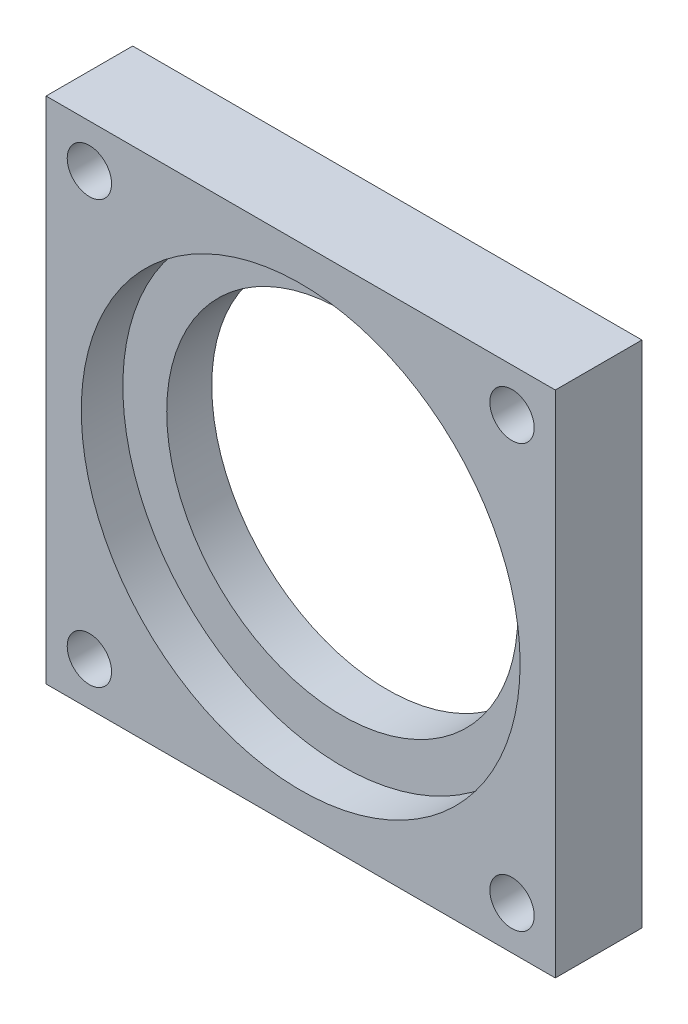
ISO-10303-21;
HEADER;
FILE_DESCRIPTION(('STEP AP214'),'2;1');
FILE_NAME('part.step','',(''),(''),'','','');
FILE_SCHEMA(('AUTOMOTIVE_DESIGN { 1 0 10303 214 1 1 1 1 }'));
ENDSEC;
DATA;
#1=APPLICATION_CONTEXT('core data for automotive mechanical design processes');
#2=APPLICATION_PROTOCOL_DEFINITION('international standard','automotive_design',2000,#1);
#3=PRODUCT_CONTEXT('',#1,'mechanical');
#4=PRODUCT('Part','Part','',(#3));
#5=PRODUCT_RELATED_PRODUCT_CATEGORY('part','',(#4));
#6=PRODUCT_DEFINITION_FORMATION('','',#4);
#7=PRODUCT_DEFINITION_CONTEXT('part definition',#1,'design');
#8=PRODUCT_DEFINITION('design','',#6,#7);
#9=PRODUCT_DEFINITION_SHAPE('','',#8);
#10=(LENGTH_UNIT() NAMED_UNIT(*) SI_UNIT(.MILLI.,.METRE.));
#11=(NAMED_UNIT(*) PLANE_ANGLE_UNIT() SI_UNIT($,.RADIAN.));
#12=(NAMED_UNIT(*) SI_UNIT($,.STERADIAN.) SOLID_ANGLE_UNIT());
#13=UNCERTAINTY_MEASURE_WITH_UNIT(LENGTH_MEASURE(1.E-05),#10,'distance_accuracy_value','');
#14=(GEOMETRIC_REPRESENTATION_CONTEXT(3) GLOBAL_UNCERTAINTY_ASSIGNED_CONTEXT((#13)) GLOBAL_UNIT_ASSIGNED_CONTEXT((#10,
#11,#12)) REPRESENTATION_CONTEXT('',''));
#15=CARTESIAN_POINT('',(0.,0.,0.));
#16=DIRECTION('',(0.,0.,1.));
#17=DIRECTION('',(1.,0.,0.));
#18=AXIS2_PLACEMENT_3D('',#15,#16,#17);
#19=CARTESIAN_POINT('',(13.99999994,-14.,4.7625));
#20=DIRECTION('',(-1.,0.,0.));
#21=DIRECTION('',(0.,0.,1.));
#22=AXIS2_PLACEMENT_3D('',#19,#20,#21);
#23=PLANE('',#22);
#24=DIRECTION('',(0.,1.,0.));
#25=VECTOR('',#24,1.);
#26=CARTESIAN_POINT('',(13.99999994,-14.,0.));
#27=LINE('',#26,#25);
#28=CARTESIAN_POINT('',(13.99999994,-14.,0.));
#29=VERTEX_POINT('',#28);
#30=CARTESIAN_POINT('',(13.99999994,14.,0.));
#31=VERTEX_POINT('',#30);
#32=EDGE_CURVE('E100',#29,#31,#27,.T.);
#33=ORIENTED_EDGE('',*,*,#32,.T.);
#34=DIRECTION('',(0.,0.,-1.));
#35=VECTOR('',#34,1.);
#36=CARTESIAN_POINT('',(13.99999994,14.,4.7625));
#37=LINE('',#36,#35);
#38=CARTESIAN_POINT('',(13.99999994,14.,4.7625));
#39=VERTEX_POINT('',#38);
#40=EDGE_CURVE('E11',#39,#31,#37,.T.);
#41=ORIENTED_EDGE('',*,*,#40,.F.);
#42=DIRECTION('',(0.,1.,0.));
#43=VECTOR('',#42,1.);
#44=CARTESIAN_POINT('',(13.99999994,-14.,4.7625));
#45=LINE('',#44,#43);
#46=CARTESIAN_POINT('',(13.99999994,-14.,4.7625));
#47=VERTEX_POINT('',#46);
#48=EDGE_CURVE('E88',#47,#39,#45,.T.);
#49=ORIENTED_EDGE('',*,*,#48,.F.);
#50=DIRECTION('',(0.,0.,-1.));
#51=VECTOR('',#50,1.);
#52=CARTESIAN_POINT('',(13.99999994,-14.,4.7625));
#53=LINE('',#52,#51);
#54=EDGE_CURVE('E96',#47,#29,#53,.T.);
#55=ORIENTED_EDGE('',*,*,#54,.T.);
#56=EDGE_LOOP('',(#33,#41,#49,#55));
#57=FACE_BOUND('',#56,.T.);
#58=ADVANCED_FACE('F37',(#57),#23,.F.);
#59=CARTESIAN_POINT('',(-13.99999994,14.,4.7625));
#60=DIRECTION('',(0.,-1.,0.));
#61=DIRECTION('',(0.,0.,-1.));
#62=AXIS2_PLACEMENT_3D('',#59,#60,#61);
#63=PLANE('',#62);
#64=DIRECTION('',(-1.,0.,0.));
#65=VECTOR('',#64,1.);
#66=CARTESIAN_POINT('',(-13.99999994,14.,0.));
#67=LINE('',#66,#65);
#68=CARTESIAN_POINT('',(-13.99999994,14.,0.));
#69=VERTEX_POINT('',#68);
#70=EDGE_CURVE('E92',#31,#69,#67,.T.);
#71=ORIENTED_EDGE('',*,*,#70,.T.);
#72=DIRECTION('',(0.,0.,-1.));
#73=VECTOR('',#72,1.);
#74=CARTESIAN_POINT('',(-13.99999994,14.,4.7625));
#75=LINE('',#74,#73);
#76=CARTESIAN_POINT('',(-13.99999994,14.,4.7625));
#77=VERTEX_POINT('',#76);
#78=EDGE_CURVE('E45',#77,#69,#75,.T.);
#79=ORIENTED_EDGE('',*,*,#78,.F.);
#80=DIRECTION('',(-1.,0.,0.));
#81=VECTOR('',#80,1.);
#82=CARTESIAN_POINT('',(-13.99999994,14.,4.7625));
#83=LINE('',#82,#81);
#84=EDGE_CURVE('E83',#39,#77,#83,.T.);
#85=ORIENTED_EDGE('',*,*,#84,.F.);
#86=ORIENTED_EDGE('',*,*,#40,.T.);
#87=EDGE_LOOP('',(#71,#79,#85,#86));
#88=FACE_BOUND('',#87,.T.);
#89=ADVANCED_FACE('F91',(#88),#63,.F.);
#90=CARTESIAN_POINT('',(-13.99999994,-14.,4.7625));
#91=DIRECTION('',(1.,0.,0.));
#92=DIRECTION('',(0.,0.,-1.));
#93=AXIS2_PLACEMENT_3D('',#90,#91,#92);
#94=PLANE('',#93);
#95=DIRECTION('',(0.,-1.,0.));
#96=VECTOR('',#95,1.);
#97=CARTESIAN_POINT('',(-13.99999994,-14.,0.));
#98=LINE('',#97,#96);
#99=CARTESIAN_POINT('',(-13.99999994,-14.,0.));
#100=VERTEX_POINT('',#99);
#101=EDGE_CURVE('E70',#69,#100,#98,.T.);
#102=ORIENTED_EDGE('',*,*,#101,.T.);
#103=DIRECTION('',(0.,0.,-1.));
#104=VECTOR('',#103,1.);
#105=CARTESIAN_POINT('',(-13.99999994,-14.,4.7625));
#106=LINE('',#105,#104);
#107=CARTESIAN_POINT('',(-13.99999994,-14.,4.7625));
#108=VERTEX_POINT('',#107);
#109=EDGE_CURVE('E93',#108,#100,#106,.T.);
#110=ORIENTED_EDGE('',*,*,#109,.F.);
#111=DIRECTION('',(0.,-1.,0.));
#112=VECTOR('',#111,1.);
#113=CARTESIAN_POINT('',(-13.99999994,-14.,4.7625));
#114=LINE('',#113,#112);
#115=EDGE_CURVE('E86',#77,#108,#114,.T.);
#116=ORIENTED_EDGE('',*,*,#115,.F.);
#117=ORIENTED_EDGE('',*,*,#78,.T.);
#118=EDGE_LOOP('',(#102,#110,#116,#117));
#119=FACE_BOUND('',#118,.T.);
#120=ADVANCED_FACE('F94',(#119),#94,.F.);
#121=CARTESIAN_POINT('',(-13.99999994,-14.,4.7625));
#122=DIRECTION('',(0.,1.,0.));
#123=DIRECTION('',(0.,0.,1.));
#124=AXIS2_PLACEMENT_3D('',#121,#122,#123);
#125=PLANE('',#124);
#126=DIRECTION('',(1.,0.,0.));
#127=VECTOR('',#126,1.);
#128=CARTESIAN_POINT('',(-13.99999994,-14.,0.));
#129=LINE('',#128,#127);
#130=EDGE_CURVE('E76',#100,#29,#129,.T.);
#131=ORIENTED_EDGE('',*,*,#130,.T.);
#132=ORIENTED_EDGE('',*,*,#54,.F.);
#133=DIRECTION('',(1.,0.,0.));
#134=VECTOR('',#133,1.);
#135=CARTESIAN_POINT('',(-13.99999994,-14.,4.7625));
#136=LINE('',#135,#134);
#137=EDGE_CURVE('E53',#108,#47,#136,.T.);
#138=ORIENTED_EDGE('',*,*,#137,.F.);
#139=ORIENTED_EDGE('',*,*,#109,.T.);
#140=EDGE_LOOP('',(#131,#132,#138,#139));
#141=FACE_BOUND('',#140,.T.);
#142=ADVANCED_FACE('F108',(#141),#125,.F.);
#143=CARTESIAN_POINT('',(13.99999994,14.,4.7625));
#144=DIRECTION('',(0.,0.,-1.));
#145=DIRECTION('',(-1.,0.,0.));
#146=AXIS2_PLACEMENT_3D('',#143,#144,#145);
#147=PLANE('',#146);
#148=CARTESIAN_POINT('',(-11.61874994,11.61875,4.7625));
#149=DIRECTION('',(0.,0.,-1.));
#150=DIRECTION('',(-1.,0.,0.));
#151=AXIS2_PLACEMENT_3D('',#148,#149,#150);
#152=CIRCLE('',#151,1.2192);
#153=CARTESIAN_POINT('',(-12.83794994,11.61875,4.7625));
#154=VERTEX_POINT('',#153);
#155=EDGE_CURVE('E152',#154,#154,#152,.T.);
#156=ORIENTED_EDGE('',*,*,#155,.T.);
#157=EDGE_LOOP('',(#156));
#158=FACE_BOUND('',#157,.T.);
#159=CARTESIAN_POINT('',(-11.61874994,-11.61875,4.7625));
#160=DIRECTION('',(0.,0.,-1.));
#161=DIRECTION('',(-1.,0.,0.));
#162=AXIS2_PLACEMENT_3D('',#159,#160,#161);
#163=CIRCLE('',#162,1.2192);
#164=CARTESIAN_POINT('',(-12.83794994,-11.61875,4.7625));
#165=VERTEX_POINT('',#164);
#166=EDGE_CURVE('E143',#165,#165,#163,.T.);
#167=ORIENTED_EDGE('',*,*,#166,.T.);
#168=EDGE_LOOP('',(#167));
#169=FACE_BOUND('',#168,.T.);
#170=CARTESIAN_POINT('',(11.61874994,-11.61875,4.7625));
#171=DIRECTION('',(0.,0.,-1.));
#172=DIRECTION('',(-1.,0.,0.));
#173=AXIS2_PLACEMENT_3D('',#170,#171,#172);
#174=CIRCLE('',#173,1.2192);
#175=CARTESIAN_POINT('',(10.39954994,-11.61875,4.7625));
#176=VERTEX_POINT('',#175);
#177=EDGE_CURVE('E134',#176,#176,#174,.T.);
#178=ORIENTED_EDGE('',*,*,#177,.T.);
#179=EDGE_LOOP('',(#178));
#180=FACE_BOUND('',#179,.T.);
#181=CARTESIAN_POINT('',(11.61874994,11.61875,4.7625));
#182=DIRECTION('',(0.,0.,-1.));
#183=DIRECTION('',(-1.,0.,0.));
#184=AXIS2_PLACEMENT_3D('',#181,#182,#183);
#185=CIRCLE('',#184,1.2192);
#186=CARTESIAN_POINT('',(10.39954994,11.61875,4.7625));
#187=VERTEX_POINT('',#186);
#188=EDGE_CURVE('E123',#187,#187,#185,.T.);
#189=ORIENTED_EDGE('',*,*,#188,.T.);
#190=EDGE_LOOP('',(#189));
#191=FACE_BOUND('',#190,.T.);
#192=CARTESIAN_POINT('',(0.,0.,4.7625));
#193=DIRECTION('',(0.,0.,1.));
#194=DIRECTION('',(1.,0.,0.));
#195=AXIS2_PLACEMENT_3D('',#192,#193,#194);
#196=CIRCLE('',#195,12.065);
#197=CARTESIAN_POINT('',(12.065,0.,4.7625));
#198=VERTEX_POINT('',#197);
#199=EDGE_CURVE('E114',#198,#198,#196,.T.);
#200=ORIENTED_EDGE('',*,*,#199,.F.);
#201=EDGE_LOOP('',(#200));
#202=FACE_BOUND('',#201,.T.);
#203=ORIENTED_EDGE('',*,*,#48,.T.);
#204=ORIENTED_EDGE('',*,*,#84,.T.);
#205=ORIENTED_EDGE('',*,*,#115,.T.);
#206=ORIENTED_EDGE('',*,*,#137,.T.);
#207=EDGE_LOOP('',(#203,#204,#205,#206));
#208=FACE_BOUND('',#207,.T.);
#209=ADVANCED_FACE('F84',(#158,#169,#180,#191,#202,#208),#147,.F.);
#210=CARTESIAN_POINT('',(13.99999994,14.,0.));
#211=DIRECTION('',(0.,0.,-1.));
#212=DIRECTION('',(-1.,0.,0.));
#213=AXIS2_PLACEMENT_3D('',#210,#211,#212);
#214=PLANE('',#213);
#215=CARTESIAN_POINT('',(-11.61874994,11.61875,0.));
#216=DIRECTION('',(0.,0.,-1.));
#217=DIRECTION('',(-1.,0.,0.));
#218=AXIS2_PLACEMENT_3D('',#215,#216,#217);
#219=CIRCLE('',#218,2.1844);
#220=CARTESIAN_POINT('',(-13.80314994,11.61875,0.));
#221=VERTEX_POINT('',#220);
#222=EDGE_CURVE('E158',#221,#221,#219,.T.);
#223=ORIENTED_EDGE('',*,*,#222,.F.);
#224=EDGE_LOOP('',(#223));
#225=FACE_BOUND('',#224,.T.);
#226=CARTESIAN_POINT('',(-11.61874994,-11.61875,0.));
#227=DIRECTION('',(0.,0.,-1.));
#228=DIRECTION('',(-1.,0.,0.));
#229=AXIS2_PLACEMENT_3D('',#226,#227,#228);
#230=CIRCLE('',#229,2.1844);
#231=CARTESIAN_POINT('',(-13.80314994,-11.61875,0.));
#232=VERTEX_POINT('',#231);
#233=EDGE_CURVE('E149',#232,#232,#230,.T.);
#234=ORIENTED_EDGE('',*,*,#233,.F.);
#235=EDGE_LOOP('',(#234));
#236=FACE_BOUND('',#235,.T.);
#237=CARTESIAN_POINT('',(11.61874994,-11.61875,0.));
#238=DIRECTION('',(0.,0.,-1.));
#239=DIRECTION('',(-1.,0.,0.));
#240=AXIS2_PLACEMENT_3D('',#237,#238,#239);
#241=CIRCLE('',#240,2.1844);
#242=CARTESIAN_POINT('',(9.43434994,-11.61875,0.));
#243=VERTEX_POINT('',#242);
#244=EDGE_CURVE('E140',#243,#243,#241,.T.);
#245=ORIENTED_EDGE('',*,*,#244,.F.);
#246=EDGE_LOOP('',(#245));
#247=FACE_BOUND('',#246,.T.);
#248=CARTESIAN_POINT('',(11.61874994,11.61875,0.));
#249=DIRECTION('',(0.,0.,-1.));
#250=DIRECTION('',(-1.,0.,0.));
#251=AXIS2_PLACEMENT_3D('',#248,#249,#250);
#252=CIRCLE('',#251,2.1844);
#253=CARTESIAN_POINT('',(9.43434994,11.61875,0.));
#254=VERTEX_POINT('',#253);
#255=EDGE_CURVE('E131',#254,#254,#252,.T.);
#256=ORIENTED_EDGE('',*,*,#255,.F.);
#257=EDGE_LOOP('',(#256));
#258=FACE_BOUND('',#257,.T.);
#259=CARTESIAN_POINT('',(0.,0.,0.));
#260=DIRECTION('',(0.,0.,1.));
#261=DIRECTION('',(1.,0.,0.));
#262=AXIS2_PLACEMENT_3D('',#259,#260,#261);
#263=CIRCLE('',#262,9.652);
#264=CARTESIAN_POINT('',(9.652,0.,0.));
#265=VERTEX_POINT('',#264);
#266=EDGE_CURVE('E117',#265,#265,#263,.T.);
#267=ORIENTED_EDGE('',*,*,#266,.T.);
#268=EDGE_LOOP('',(#267));
#269=FACE_BOUND('',#268,.T.);
#270=ORIENTED_EDGE('',*,*,#32,.F.);
#271=ORIENTED_EDGE('',*,*,#130,.F.);
#272=ORIENTED_EDGE('',*,*,#101,.F.);
#273=ORIENTED_EDGE('',*,*,#70,.F.);
#274=EDGE_LOOP('',(#270,#271,#272,#273));
#275=FACE_BOUND('',#274,.T.);
#276=ADVANCED_FACE('F111',(#225,#236,#247,#258,#269,#275),#214,.T.);
#277=CARTESIAN_POINT('',(0.,0.,2.4765));
#278=DIRECTION('',(0.,0.,1.));
#279=DIRECTION('',(1.,0.,0.));
#280=AXIS2_PLACEMENT_3D('',#277,#278,#279);
#281=CYLINDRICAL_SURFACE('',#280,12.065);
#282=CARTESIAN_POINT('',(0.,0.,2.4765));
#283=DIRECTION('',(0.,0.,1.));
#284=DIRECTION('',(1.,0.,0.));
#285=AXIS2_PLACEMENT_3D('',#282,#283,#284);
#286=CIRCLE('',#285,12.065);
#287=CARTESIAN_POINT('',(12.065,0.,2.4765));
#288=VERTEX_POINT('',#287);
#289=EDGE_CURVE('E103',#288,#288,#286,.T.);
#290=ORIENTED_EDGE('',*,*,#289,.F.);
#291=EDGE_LOOP('',(#290));
#292=FACE_BOUND('',#291,.T.);
#293=ORIENTED_EDGE('',*,*,#199,.T.);
#294=EDGE_LOOP('',(#293));
#295=FACE_BOUND('',#294,.T.);
#296=ADVANCED_FACE('F166',(#292,#295),#281,.F.);
#297=CARTESIAN_POINT('',(0.,0.,2.4765));
#298=DIRECTION('',(0.,0.,1.));
#299=DIRECTION('',(1.,0.,0.));
#300=AXIS2_PLACEMENT_3D('',#297,#298,#299);
#301=PLANE('',#300);
#302=CARTESIAN_POINT('',(0.,0.,2.4765));
#303=DIRECTION('',(0.,0.,1.));
#304=DIRECTION('',(1.,0.,0.));
#305=AXIS2_PLACEMENT_3D('',#302,#303,#304);
#306=CIRCLE('',#305,9.652);
#307=CARTESIAN_POINT('',(9.652,0.,2.4765));
#308=VERTEX_POINT('',#307);
#309=EDGE_CURVE('E120',#308,#308,#306,.T.);
#310=ORIENTED_EDGE('',*,*,#309,.F.);
#311=EDGE_LOOP('',(#310));
#312=FACE_BOUND('',#311,.T.);
#313=ORIENTED_EDGE('',*,*,#289,.T.);
#314=EDGE_LOOP('',(#313));
#315=FACE_BOUND('',#314,.T.);
#316=ADVANCED_FACE('F180',(#312,#315),#301,.T.);
#317=CARTESIAN_POINT('',(0.,0.,0.));
#318=DIRECTION('',(0.,0.,1.));
#319=DIRECTION('',(1.,0.,0.));
#320=AXIS2_PLACEMENT_3D('',#317,#318,#319);
#321=CYLINDRICAL_SURFACE('',#320,9.652);
#322=ORIENTED_EDGE('',*,*,#266,.F.);
#323=EDGE_LOOP('',(#322));
#324=FACE_BOUND('',#323,.T.);
#325=ORIENTED_EDGE('',*,*,#309,.T.);
#326=EDGE_LOOP('',(#325));
#327=FACE_BOUND('',#326,.T.);
#328=ADVANCED_FACE('F176',(#324,#327),#321,.F.);
#329=CARTESIAN_POINT('',(11.61874994,11.61875,0.));
#330=DIRECTION('',(0.,0.,-1.));
#331=DIRECTION('',(-1.,0.,0.));
#332=AXIS2_PLACEMENT_3D('',#329,#330,#331);
#333=CYLINDRICAL_SURFACE('',#332,1.2192);
#334=ORIENTED_EDGE('',*,*,#188,.F.);
#335=EDGE_LOOP('',(#334));
#336=FACE_BOUND('',#335,.T.);
#337=CARTESIAN_POINT('',(11.61874994,11.61875,1.11033558664972));
#338=DIRECTION('',(0.,0.,-1.));
#339=DIRECTION('',(-1.,0.,0.));
#340=AXIS2_PLACEMENT_3D('',#337,#338,#339);
#341=CIRCLE('',#340,1.2192);
#342=CARTESIAN_POINT('',(10.39954994,11.61875,1.11033558664972));
#343=VERTEX_POINT('',#342);
#344=EDGE_CURVE('E128',#343,#343,#341,.T.);
#345=ORIENTED_EDGE('',*,*,#344,.T.);
#346=EDGE_LOOP('',(#345));
#347=FACE_BOUND('',#346,.T.);
#348=ADVANCED_FACE('F179',(#336,#347),#333,.F.);
#349=CARTESIAN_POINT('',(11.61874994,11.61875,0.));
#350=DIRECTION('',(0.,0.,-1.));
#351=DIRECTION('',(-1.,0.,0.));
#352=AXIS2_PLACEMENT_3D('',#349,#350,#351);
#353=CONICAL_SURFACE('',#352,2.1844,0.715584993317675);
#354=ORIENTED_EDGE('',*,*,#344,.F.);
#355=EDGE_LOOP('',(#354));
#356=FACE_BOUND('',#355,.T.);
#357=ORIENTED_EDGE('',*,*,#255,.T.);
#358=EDGE_LOOP('',(#357));
#359=FACE_BOUND('',#358,.T.);
#360=ADVANCED_FACE('F253',(#356,#359),#353,.F.);
#361=CARTESIAN_POINT('',(11.61874994,-11.61875,0.));
#362=DIRECTION('',(0.,0.,-1.));
#363=DIRECTION('',(-1.,0.,0.));
#364=AXIS2_PLACEMENT_3D('',#361,#362,#363);
#365=CYLINDRICAL_SURFACE('',#364,1.2192);
#366=ORIENTED_EDGE('',*,*,#177,.F.);
#367=EDGE_LOOP('',(#366));
#368=FACE_BOUND('',#367,.T.);
#369=CARTESIAN_POINT('',(11.61874994,-11.61875,1.11033558664972));
#370=DIRECTION('',(0.,0.,-1.));
#371=DIRECTION('',(-1.,0.,0.));
#372=AXIS2_PLACEMENT_3D('',#369,#370,#371);
#373=CIRCLE('',#372,1.2192);
#374=CARTESIAN_POINT('',(10.39954994,-11.61875,1.11033558664972));
#375=VERTEX_POINT('',#374);
#376=EDGE_CURVE('E137',#375,#375,#373,.T.);
#377=ORIENTED_EDGE('',*,*,#376,.T.);
#378=EDGE_LOOP('',(#377));
#379=FACE_BOUND('',#378,.T.);
#380=ADVANCED_FACE('F263',(#368,#379),#365,.F.);
#381=CARTESIAN_POINT('',(11.61874994,-11.61875,0.));
#382=DIRECTION('',(0.,0.,-1.));
#383=DIRECTION('',(-1.,0.,0.));
#384=AXIS2_PLACEMENT_3D('',#381,#382,#383);
#385=CONICAL_SURFACE('',#384,2.1844,0.715584993317675);
#386=ORIENTED_EDGE('',*,*,#376,.F.);
#387=EDGE_LOOP('',(#386));
#388=FACE_BOUND('',#387,.T.);
#389=ORIENTED_EDGE('',*,*,#244,.T.);
#390=EDGE_LOOP('',(#389));
#391=FACE_BOUND('',#390,.T.);
#392=ADVANCED_FACE('F273',(#388,#391),#385,.F.);
#393=CARTESIAN_POINT('',(-11.61874994,-11.61875,0.));
#394=DIRECTION('',(0.,0.,-1.));
#395=DIRECTION('',(-1.,0.,0.));
#396=AXIS2_PLACEMENT_3D('',#393,#394,#395);
#397=CYLINDRICAL_SURFACE('',#396,1.2192);
#398=ORIENTED_EDGE('',*,*,#166,.F.);
#399=EDGE_LOOP('',(#398));
#400=FACE_BOUND('',#399,.T.);
#401=CARTESIAN_POINT('',(-11.61874994,-11.61875,1.11033558664972));
#402=DIRECTION('',(0.,0.,-1.));
#403=DIRECTION('',(-1.,0.,0.));
#404=AXIS2_PLACEMENT_3D('',#401,#402,#403);
#405=CIRCLE('',#404,1.2192);
#406=CARTESIAN_POINT('',(-12.83794994,-11.61875,1.11033558664972));
#407=VERTEX_POINT('',#406);
#408=EDGE_CURVE('E146',#407,#407,#405,.T.);
#409=ORIENTED_EDGE('',*,*,#408,.T.);
#410=EDGE_LOOP('',(#409));
#411=FACE_BOUND('',#410,.T.);
#412=ADVANCED_FACE('F283',(#400,#411),#397,.F.);
#413=CARTESIAN_POINT('',(-11.61874994,-11.61875,0.));
#414=DIRECTION('',(0.,0.,-1.));
#415=DIRECTION('',(-1.,0.,0.));
#416=AXIS2_PLACEMENT_3D('',#413,#414,#415);
#417=CONICAL_SURFACE('',#416,2.1844,0.715584993317675);
#418=ORIENTED_EDGE('',*,*,#408,.F.);
#419=EDGE_LOOP('',(#418));
#420=FACE_BOUND('',#419,.T.);
#421=ORIENTED_EDGE('',*,*,#233,.T.);
#422=EDGE_LOOP('',(#421));
#423=FACE_BOUND('',#422,.T.);
#424=ADVANCED_FACE('F293',(#420,#423),#417,.F.);
#425=CARTESIAN_POINT('',(-11.61874994,11.61875,0.));
#426=DIRECTION('',(0.,0.,-1.));
#427=DIRECTION('',(-1.,0.,0.));
#428=AXIS2_PLACEMENT_3D('',#425,#426,#427);
#429=CYLINDRICAL_SURFACE('',#428,1.2192);
#430=ORIENTED_EDGE('',*,*,#155,.F.);
#431=EDGE_LOOP('',(#430));
#432=FACE_BOUND('',#431,.T.);
#433=CARTESIAN_POINT('',(-11.61874994,11.61875,1.11033558664972));
#434=DIRECTION('',(0.,0.,-1.));
#435=DIRECTION('',(-1.,0.,0.));
#436=AXIS2_PLACEMENT_3D('',#433,#434,#435);
#437=CIRCLE('',#436,1.2192);
#438=CARTESIAN_POINT('',(-12.83794994,11.61875,1.11033558664972));
#439=VERTEX_POINT('',#438);
#440=EDGE_CURVE('E155',#439,#439,#437,.T.);
#441=ORIENTED_EDGE('',*,*,#440,.T.);
#442=EDGE_LOOP('',(#441));
#443=FACE_BOUND('',#442,.T.);
#444=ADVANCED_FACE('F303',(#432,#443),#429,.F.);
#445=CARTESIAN_POINT('',(-11.61874994,11.61875,0.));
#446=DIRECTION('',(0.,0.,-1.));
#447=DIRECTION('',(-1.,0.,0.));
#448=AXIS2_PLACEMENT_3D('',#445,#446,#447);
#449=CONICAL_SURFACE('',#448,2.1844,0.715584993317675);
#450=ORIENTED_EDGE('',*,*,#440,.F.);
#451=EDGE_LOOP('',(#450));
#452=FACE_BOUND('',#451,.T.);
#453=ORIENTED_EDGE('',*,*,#222,.T.);
#454=EDGE_LOOP('',(#453));
#455=FACE_BOUND('',#454,.T.);
#456=ADVANCED_FACE('F162',(#452,#455),#449,.F.);
#457=CLOSED_SHELL('',(#58,#89,#120,#142,#209,#276,#296,#316,#328,#348,#360,#380,#392,#412,#424,
#444,#456));
#458=MANIFOLD_SOLID_BREP('B2',#457);
#459=ADVANCED_BREP_SHAPE_REPRESENTATION('',(#18,#458),#14);
#460=SHAPE_DEFINITION_REPRESENTATION(#9,#459);
ENDSEC;
END-ISO-10303-21;
